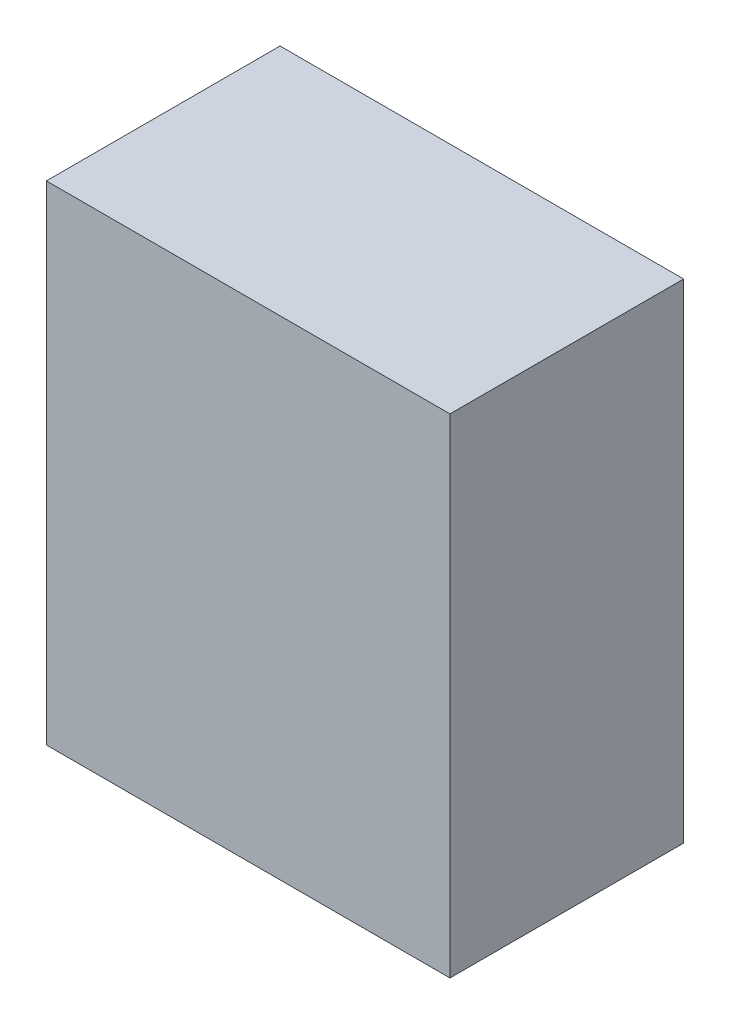
ISO-10303-21;
HEADER;
FILE_DESCRIPTION(('STEP AP214'),'2;1');
FILE_NAME('part.step','',(''),(''),'','','');
FILE_SCHEMA(('AUTOMOTIVE_DESIGN { 1 0 10303 214 1 1 1 1 }'));
ENDSEC;
DATA;
#1=APPLICATION_CONTEXT('core data for automotive mechanical design processes');
#2=APPLICATION_PROTOCOL_DEFINITION('international standard','automotive_design',2000,#1);
#3=PRODUCT_CONTEXT('',#1,'mechanical');
#4=PRODUCT('Part','Part','',(#3));
#5=PRODUCT_RELATED_PRODUCT_CATEGORY('part','',(#4));
#6=PRODUCT_DEFINITION_FORMATION('','',#4);
#7=PRODUCT_DEFINITION_CONTEXT('part definition',#1,'design');
#8=PRODUCT_DEFINITION('design','',#6,#7);
#9=PRODUCT_DEFINITION_SHAPE('','',#8);
#10=(LENGTH_UNIT() NAMED_UNIT(*) SI_UNIT(.MILLI.,.METRE.));
#11=(NAMED_UNIT(*) PLANE_ANGLE_UNIT() SI_UNIT($,.RADIAN.));
#12=(NAMED_UNIT(*) SI_UNIT($,.STERADIAN.) SOLID_ANGLE_UNIT());
#13=UNCERTAINTY_MEASURE_WITH_UNIT(LENGTH_MEASURE(1.E-05),#10,'distance_accuracy_value','');
#14=(GEOMETRIC_REPRESENTATION_CONTEXT(3) GLOBAL_UNCERTAINTY_ASSIGNED_CONTEXT((#13)) GLOBAL_UNIT_ASSIGNED_CONTEXT((#10,
#11,#12)) REPRESENTATION_CONTEXT('',''));
#15=CARTESIAN_POINT('',(0.,0.,0.));
#16=DIRECTION('',(0.,0.,1.));
#17=DIRECTION('',(1.,0.,0.));
#18=AXIS2_PLACEMENT_3D('',#15,#16,#17);
#19=CARTESIAN_POINT('',(33.24999984,23.849994876484,0.5499989));
#20=DIRECTION('',(0.,0.,1.));
#21=DIRECTION('',(1.,0.,0.));
#22=AXIS2_PLACEMENT_3D('',#19,#20,#21);
#23=PLANE('',#22);
#24=DIRECTION('',(1.,0.,0.));
#25=VECTOR('',#24,1.);
#26=CARTESIAN_POINT('',(32.77499952,23.274994756484,0.5499989));
#27=LINE('',#26,#25);
#28=CARTESIAN_POINT('',(32.77499952,23.274994756484,0.5499989));
#29=VERTEX_POINT('',#28);
#30=CARTESIAN_POINT('',(33.72500016,23.274994756484,0.5499989));
#31=VERTEX_POINT('',#30);
#32=EDGE_CURVE('E76',#29,#31,#27,.T.);
#33=ORIENTED_EDGE('',*,*,#32,.T.);
#34=DIRECTION('',(0.,1.,0.));
#35=VECTOR('',#34,1.);
#36=CARTESIAN_POINT('',(33.72500016,23.274994756484,0.5499989));
#37=LINE('',#36,#35);
#38=CARTESIAN_POINT('',(33.72500016,24.424994996484,0.5499989));
#39=VERTEX_POINT('',#38);
#40=EDGE_CURVE('E58',#31,#39,#37,.T.);
#41=ORIENTED_EDGE('',*,*,#40,.T.);
#42=DIRECTION('',(1.,0.,0.));
#43=VECTOR('',#42,1.);
#44=CARTESIAN_POINT('',(33.72500016,24.424994996484,0.5499989));
#45=LINE('',#44,#43);
#46=CARTESIAN_POINT('',(32.77499952,24.424994996484,0.5499989));
#47=VERTEX_POINT('',#46);
#48=EDGE_CURVE('E20',#39,#47,#45,.F.);
#49=ORIENTED_EDGE('',*,*,#48,.T.);
#50=DIRECTION('',(0.,1.,0.));
#51=VECTOR('',#50,1.);
#52=CARTESIAN_POINT('',(32.77499952,24.424994996484,0.5499989));
#53=LINE('',#52,#51);
#54=EDGE_CURVE('E55',#47,#29,#53,.F.);
#55=ORIENTED_EDGE('',*,*,#54,.T.);
#56=EDGE_LOOP('',(#33,#41,#49,#55));
#57=FACE_BOUND('',#56,.T.);
#58=ADVANCED_FACE('F17',(#57),#23,.T.);
#59=CARTESIAN_POINT('',(33.72500016,24.424994996484,0.));
#60=DIRECTION('',(0.,-1.,0.));
#61=DIRECTION('',(0.,0.,-1.));
#62=AXIS2_PLACEMENT_3D('',#59,#60,#61);
#63=PLANE('',#62);
#64=DIRECTION('',(0.,0.,-1.));
#65=VECTOR('',#64,1.);
#66=CARTESIAN_POINT('',(32.77499952,24.424994996484,0.));
#67=LINE('',#66,#65);
#68=CARTESIAN_POINT('',(32.77499952,24.424994996484,0.));
#69=VERTEX_POINT('',#68);
#70=EDGE_CURVE('E63',#69,#47,#67,.F.);
#71=ORIENTED_EDGE('',*,*,#70,.T.);
#72=ORIENTED_EDGE('',*,*,#48,.F.);
#73=DIRECTION('',(0.,0.,1.));
#74=VECTOR('',#73,1.);
#75=CARTESIAN_POINT('',(33.72500016,24.424994996484,0.));
#76=LINE('',#75,#74);
#77=CARTESIAN_POINT('',(33.72500016,24.424994996484,0.));
#78=VERTEX_POINT('',#77);
#79=EDGE_CURVE('E80',#39,#78,#76,.F.);
#80=ORIENTED_EDGE('',*,*,#79,.T.);
#81=DIRECTION('',(1.,0.,0.));
#82=VECTOR('',#81,1.);
#83=CARTESIAN_POINT('',(33.24999984,24.424994996484,0.));
#84=LINE('',#83,#82);
#85=EDGE_CURVE('E73',#78,#69,#84,.F.);
#86=ORIENTED_EDGE('',*,*,#85,.T.);
#87=EDGE_LOOP('',(#71,#72,#80,#86));
#88=FACE_BOUND('',#87,.T.);
#89=ADVANCED_FACE('F72',(#88),#63,.F.);
#90=CARTESIAN_POINT('',(32.77499952,24.424994996484,0.));
#91=DIRECTION('',(1.,0.,0.));
#92=DIRECTION('',(0.,0.,-1.));
#93=AXIS2_PLACEMENT_3D('',#90,#91,#92);
#94=PLANE('',#93);
#95=DIRECTION('',(0.,0.,1.));
#96=VECTOR('',#95,1.);
#97=CARTESIAN_POINT('',(32.77499952,23.274994756484,0.));
#98=LINE('',#97,#96);
#99=CARTESIAN_POINT('',(32.77499952,23.274994756484,0.));
#100=VERTEX_POINT('',#99);
#101=EDGE_CURVE('E69',#100,#29,#98,.T.);
#102=ORIENTED_EDGE('',*,*,#101,.T.);
#103=ORIENTED_EDGE('',*,*,#54,.F.);
#104=ORIENTED_EDGE('',*,*,#70,.F.);
#105=DIRECTION('',(0.,1.,0.));
#106=VECTOR('',#105,1.);
#107=CARTESIAN_POINT('',(32.77499952,23.849994876484,0.));
#108=LINE('',#107,#106);
#109=EDGE_CURVE('E83',#69,#100,#108,.F.);
#110=ORIENTED_EDGE('',*,*,#109,.T.);
#111=EDGE_LOOP('',(#102,#103,#104,#110));
#112=FACE_BOUND('',#111,.T.);
#113=ADVANCED_FACE('F66',(#112),#94,.F.);
#114=CARTESIAN_POINT('',(32.77499952,23.274994756484,0.));
#115=DIRECTION('',(0.,1.,0.));
#116=DIRECTION('',(0.,0.,1.));
#117=AXIS2_PLACEMENT_3D('',#114,#115,#116);
#118=PLANE('',#117);
#119=DIRECTION('',(0.,0.,1.));
#120=VECTOR('',#119,1.);
#121=CARTESIAN_POINT('',(33.72500016,23.274994756484,0.));
#122=LINE('',#121,#120);
#123=CARTESIAN_POINT('',(33.72500016,23.274994756484,0.));
#124=VERTEX_POINT('',#123);
#125=EDGE_CURVE('E34',#124,#31,#122,.T.);
#126=ORIENTED_EDGE('',*,*,#125,.T.);
#127=ORIENTED_EDGE('',*,*,#32,.F.);
#128=ORIENTED_EDGE('',*,*,#101,.F.);
#129=DIRECTION('',(1.,0.,0.));
#130=VECTOR('',#129,1.);
#131=CARTESIAN_POINT('',(33.24999984,23.274994756484,0.));
#132=LINE('',#131,#130);
#133=EDGE_CURVE('E26',#100,#124,#132,.T.);
#134=ORIENTED_EDGE('',*,*,#133,.T.);
#135=EDGE_LOOP('',(#126,#127,#128,#134));
#136=FACE_BOUND('',#135,.T.);
#137=ADVANCED_FACE('F88',(#136),#118,.F.);
#138=CARTESIAN_POINT('',(33.72500016,23.274994756484,0.));
#139=DIRECTION('',(-1.,0.,0.));
#140=DIRECTION('',(0.,0.,1.));
#141=AXIS2_PLACEMENT_3D('',#138,#139,#140);
#142=PLANE('',#141);
#143=ORIENTED_EDGE('',*,*,#79,.F.);
#144=ORIENTED_EDGE('',*,*,#40,.F.);
#145=ORIENTED_EDGE('',*,*,#125,.F.);
#146=DIRECTION('',(0.,1.,0.));
#147=VECTOR('',#146,1.);
#148=CARTESIAN_POINT('',(33.72500016,23.849994876484,0.));
#149=LINE('',#148,#147);
#150=EDGE_CURVE('E11',#124,#78,#149,.T.);
#151=ORIENTED_EDGE('',*,*,#150,.T.);
#152=EDGE_LOOP('',(#143,#144,#145,#151));
#153=FACE_BOUND('',#152,.T.);
#154=ADVANCED_FACE('F91',(#153),#142,.F.);
#155=CARTESIAN_POINT('',(33.24999984,23.849994876484,0.));
#156=DIRECTION('',(0.,0.,1.));
#157=DIRECTION('',(1.,0.,0.));
#158=AXIS2_PLACEMENT_3D('',#155,#156,#157);
#159=PLANE('',#158);
#160=ORIENTED_EDGE('',*,*,#133,.F.);
#161=ORIENTED_EDGE('',*,*,#109,.F.);
#162=ORIENTED_EDGE('',*,*,#85,.F.);
#163=ORIENTED_EDGE('',*,*,#150,.F.);
#164=EDGE_LOOP('',(#160,#161,#162,#163));
#165=FACE_BOUND('',#164,.T.);
#166=ADVANCED_FACE('F90',(#165),#159,.F.);
#167=CLOSED_SHELL('',(#58,#89,#113,#137,#154,#166));
#168=MANIFOLD_SOLID_BREP('B1',#167);
#169=ADVANCED_BREP_SHAPE_REPRESENTATION('',(#18,#168),#14);
#170=SHAPE_DEFINITION_REPRESENTATION(#9,#169);
ENDSEC;
END-ISO-10303-21;
